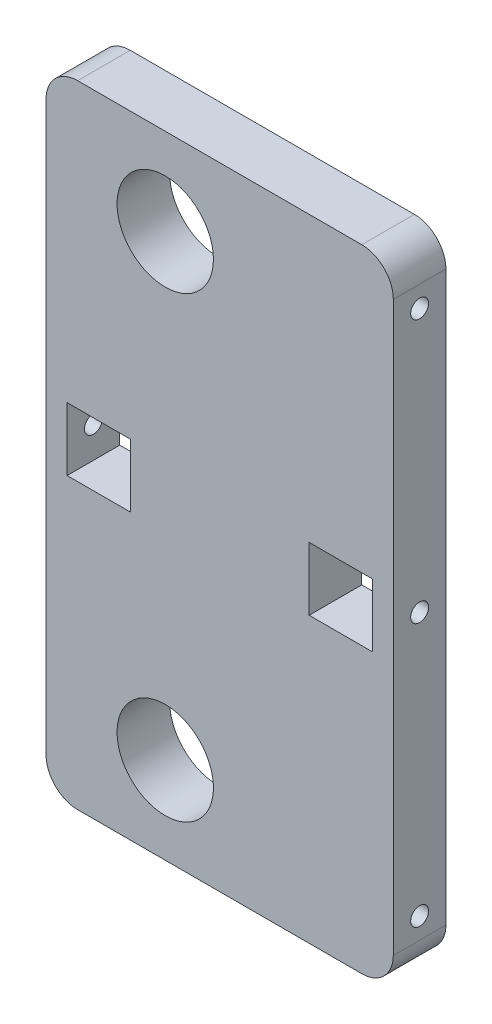
ISO-10303-21;
HEADER;
FILE_DESCRIPTION(('STEP AP214'),'2;1');
FILE_NAME('part.step','',(''),(''),'','','');
FILE_SCHEMA(('AUTOMOTIVE_DESIGN { 1 0 10303 214 1 1 1 1 }'));
ENDSEC;
DATA;
#1=APPLICATION_CONTEXT('core data for automotive mechanical design processes');
#2=APPLICATION_PROTOCOL_DEFINITION('international standard','automotive_design',2000,#1);
#3=PRODUCT_CONTEXT('',#1,'mechanical');
#4=PRODUCT('Part','Part','',(#3));
#5=PRODUCT_RELATED_PRODUCT_CATEGORY('part','',(#4));
#6=PRODUCT_DEFINITION_FORMATION('','',#4);
#7=PRODUCT_DEFINITION_CONTEXT('part definition',#1,'design');
#8=PRODUCT_DEFINITION('design','',#6,#7);
#9=PRODUCT_DEFINITION_SHAPE('','',#8);
#10=(LENGTH_UNIT() NAMED_UNIT(*) SI_UNIT(.MILLI.,.METRE.));
#11=(NAMED_UNIT(*) PLANE_ANGLE_UNIT() SI_UNIT($,.RADIAN.));
#12=(NAMED_UNIT(*) SI_UNIT($,.STERADIAN.) SOLID_ANGLE_UNIT());
#13=UNCERTAINTY_MEASURE_WITH_UNIT(LENGTH_MEASURE(1.E-05),#10,'distance_accuracy_value','');
#14=(GEOMETRIC_REPRESENTATION_CONTEXT(3) GLOBAL_UNCERTAINTY_ASSIGNED_CONTEXT((#13)) GLOBAL_UNIT_ASSIGNED_CONTEXT((#10,
#11,#12)) REPRESENTATION_CONTEXT('',''));
#15=CARTESIAN_POINT('',(0.,0.,0.));
#16=DIRECTION('',(0.,0.,1.));
#17=DIRECTION('',(1.,0.,0.));
#18=AXIS2_PLACEMENT_3D('',#15,#16,#17);
#19=CARTESIAN_POINT('',(0.,0.,5.));
#20=DIRECTION('',(0.,0.,-1.));
#21=DIRECTION('',(-1.,0.,0.));
#22=AXIS2_PLACEMENT_3D('',#19,#20,#21);
#23=PLANE('',#22);
#24=DIRECTION('',(0.,1.,0.));
#25=VECTOR('',#24,1.);
#26=CARTESIAN_POINT('',(-8.5,-3.,5.));
#27=LINE('',#26,#25);
#28=CARTESIAN_POINT('',(-8.5,-3.,5.));
#29=VERTEX_POINT('',#28);
#30=CARTESIAN_POINT('',(-8.5,3.,5.));
#31=VERTEX_POINT('',#30);
#32=EDGE_CURVE('E212',#29,#31,#27,.T.);
#33=ORIENTED_EDGE('',*,*,#32,.F.);
#34=DIRECTION('',(1.,0.,0.));
#35=VECTOR('',#34,1.);
#36=CARTESIAN_POINT('',(-14.5,-3.,5.));
#37=LINE('',#36,#35);
#38=CARTESIAN_POINT('',(-14.5,-3.,5.));
#39=VERTEX_POINT('',#38);
#40=EDGE_CURVE('E223',#39,#29,#37,.T.);
#41=ORIENTED_EDGE('',*,*,#40,.F.);
#42=DIRECTION('',(0.,-1.,0.));
#43=VECTOR('',#42,1.);
#44=CARTESIAN_POINT('',(-14.5,-3.,5.));
#45=LINE('',#44,#43);
#46=CARTESIAN_POINT('',(-14.5,3.,5.));
#47=VERTEX_POINT('',#46);
#48=EDGE_CURVE('E219',#47,#39,#45,.T.);
#49=ORIENTED_EDGE('',*,*,#48,.F.);
#50=DIRECTION('',(-1.,0.,0.));
#51=VECTOR('',#50,1.);
#52=CARTESIAN_POINT('',(-14.5,3.,5.));
#53=LINE('',#52,#51);
#54=EDGE_CURVE('E215',#31,#47,#53,.T.);
#55=ORIENTED_EDGE('',*,*,#54,.F.);
#56=EDGE_LOOP('',(#33,#41,#49,#55));
#57=FACE_BOUND('',#56,.T.);
#58=DIRECTION('',(1.,0.,0.));
#59=VECTOR('',#58,1.);
#60=CARTESIAN_POINT('',(-16.5,-30.,5.));
#61=LINE('',#60,#59);
#62=CARTESIAN_POINT('',(-13.5,-30.,5.));
#63=VERTEX_POINT('',#62);
#64=CARTESIAN_POINT('',(13.5,-30.,5.));
#65=VERTEX_POINT('',#64);
#66=EDGE_CURVE('E282',#63,#65,#61,.T.);
#67=ORIENTED_EDGE('',*,*,#66,.T.);
#68=CARTESIAN_POINT('',(13.5,-27.,5.));
#69=DIRECTION('',(0.,0.,-1.));
#70=DIRECTION('',(-1.,0.,0.));
#71=AXIS2_PLACEMENT_3D('',#68,#69,#70);
#72=CIRCLE('',#71,3.);
#73=CARTESIAN_POINT('',(16.5,-27.,5.));
#74=VERTEX_POINT('',#73);
#75=EDGE_CURVE('E343',#65,#74,#72,.F.);
#76=ORIENTED_EDGE('',*,*,#75,.T.);
#77=DIRECTION('',(0.,1.,0.));
#78=VECTOR('',#77,1.);
#79=CARTESIAN_POINT('',(16.5,-30.,5.));
#80=LINE('',#79,#78);
#81=CARTESIAN_POINT('',(16.5,27.,5.));
#82=VERTEX_POINT('',#81);
#83=EDGE_CURVE('E271',#74,#82,#80,.T.);
#84=ORIENTED_EDGE('',*,*,#83,.T.);
#85=CARTESIAN_POINT('',(13.5,27.,5.));
#86=DIRECTION('',(0.,0.,-1.));
#87=DIRECTION('',(-1.,0.,0.));
#88=AXIS2_PLACEMENT_3D('',#85,#86,#87);
#89=CIRCLE('',#88,3.);
#90=CARTESIAN_POINT('',(13.5,30.,5.));
#91=VERTEX_POINT('',#90);
#92=EDGE_CURVE('E335',#82,#91,#89,.F.);
#93=ORIENTED_EDGE('',*,*,#92,.T.);
#94=DIRECTION('',(-1.,0.,0.));
#95=VECTOR('',#94,1.);
#96=CARTESIAN_POINT('',(-16.5,30.,5.));
#97=LINE('',#96,#95);
#98=CARTESIAN_POINT('',(-13.5,30.,5.));
#99=VERTEX_POINT('',#98);
#100=EDGE_CURVE('E275',#91,#99,#97,.T.);
#101=ORIENTED_EDGE('',*,*,#100,.T.);
#102=CARTESIAN_POINT('',(-13.5,27.,5.));
#103=DIRECTION('',(0.,0.,-1.));
#104=DIRECTION('',(-1.,0.,0.));
#105=AXIS2_PLACEMENT_3D('',#102,#103,#104);
#106=CIRCLE('',#105,3.);
#107=CARTESIAN_POINT('',(-16.5,27.,5.));
#108=VERTEX_POINT('',#107);
#109=EDGE_CURVE('E64',#99,#108,#106,.F.);
#110=ORIENTED_EDGE('',*,*,#109,.T.);
#111=DIRECTION('',(0.,-1.,0.));
#112=VECTOR('',#111,1.);
#113=CARTESIAN_POINT('',(-16.5,-30.,5.));
#114=LINE('',#113,#112);
#115=CARTESIAN_POINT('',(-16.5,-27.,5.));
#116=VERTEX_POINT('',#115);
#117=EDGE_CURVE('E279',#108,#116,#114,.T.);
#118=ORIENTED_EDGE('',*,*,#117,.T.);
#119=CARTESIAN_POINT('',(-13.5,-27.,5.));
#120=DIRECTION('',(0.,0.,-1.));
#121=DIRECTION('',(-1.,0.,0.));
#122=AXIS2_PLACEMENT_3D('',#119,#120,#121);
#123=CIRCLE('',#122,3.);
#124=EDGE_CURVE('E340',#116,#63,#123,.F.);
#125=ORIENTED_EDGE('',*,*,#124,.T.);
#126=EDGE_LOOP('',(#67,#76,#84,#93,#101,#110,#118,#125));
#127=FACE_BOUND('',#126,.T.);
#128=CARTESIAN_POINT('',(-5.175,21.75,5.));
#129=DIRECTION('',(0.,0.,1.));
#130=DIRECTION('',(1.,0.,0.));
#131=AXIS2_PLACEMENT_3D('',#128,#129,#130);
#132=CIRCLE('',#131,4.58);
#133=CARTESIAN_POINT('',(-0.595000000000001,21.75,5.));
#134=VERTEX_POINT('',#133);
#135=EDGE_CURVE('E263',#134,#134,#132,.T.);
#136=ORIENTED_EDGE('',*,*,#135,.F.);
#137=EDGE_LOOP('',(#136));
#138=FACE_BOUND('',#137,.T.);
#139=CARTESIAN_POINT('',(-5.17499999999999,-21.75,5.));
#140=DIRECTION('',(0.,0.,1.));
#141=DIRECTION('',(-1.,0.,0.));
#142=AXIS2_PLACEMENT_3D('',#139,#140,#141);
#143=CIRCLE('',#142,4.58);
#144=CARTESIAN_POINT('',(-9.75499999999999,-21.75,5.));
#145=VERTEX_POINT('',#144);
#146=EDGE_CURVE('E255',#145,#145,#143,.T.);
#147=ORIENTED_EDGE('',*,*,#146,.F.);
#148=EDGE_LOOP('',(#147));
#149=FACE_BOUND('',#148,.T.);
#150=DIRECTION('',(0.,1.,0.));
#151=VECTOR('',#150,1.);
#152=CARTESIAN_POINT('',(14.5,-3.,5.));
#153=LINE('',#152,#151);
#154=CARTESIAN_POINT('',(14.5,-3.,5.));
#155=VERTEX_POINT('',#154);
#156=CARTESIAN_POINT('',(14.5,3.,5.));
#157=VERTEX_POINT('',#156);
#158=EDGE_CURVE('E157',#155,#157,#153,.T.);
#159=ORIENTED_EDGE('',*,*,#158,.F.);
#160=DIRECTION('',(1.,0.,0.));
#161=VECTOR('',#160,1.);
#162=CARTESIAN_POINT('',(14.5,-3.,5.));
#163=LINE('',#162,#161);
#164=CARTESIAN_POINT('',(8.50000000000001,-3.,5.));
#165=VERTEX_POINT('',#164);
#166=EDGE_CURVE('E186',#165,#155,#163,.T.);
#167=ORIENTED_EDGE('',*,*,#166,.F.);
#168=DIRECTION('',(0.,-1.,0.));
#169=VECTOR('',#168,1.);
#170=CARTESIAN_POINT('',(8.50000000000001,-3.,5.));
#171=LINE('',#170,#169);
#172=CARTESIAN_POINT('',(8.50000000000001,3.,5.));
#173=VERTEX_POINT('',#172);
#174=EDGE_CURVE('E182',#173,#165,#171,.T.);
#175=ORIENTED_EDGE('',*,*,#174,.F.);
#176=DIRECTION('',(-1.,0.,0.));
#177=VECTOR('',#176,1.);
#178=CARTESIAN_POINT('',(14.5,3.,5.));
#179=LINE('',#178,#177);
#180=EDGE_CURVE('E168',#157,#173,#179,.T.);
#181=ORIENTED_EDGE('',*,*,#180,.F.);
#182=EDGE_LOOP('',(#159,#167,#175,#181));
#183=FACE_BOUND('',#182,.T.);
#184=ADVANCED_FACE('F41',(#57,#127,#138,#149,#183),#23,.F.);
#185=CARTESIAN_POINT('',(0.,0.,0.));
#186=DIRECTION('',(0.,0.,-1.));
#187=DIRECTION('',(-1.,0.,0.));
#188=AXIS2_PLACEMENT_3D('',#185,#186,#187);
#189=PLANE('',#188);
#190=CARTESIAN_POINT('',(-5.175,21.75,0.));
#191=DIRECTION('',(0.,0.,1.));
#192=DIRECTION('',(1.,0.,0.));
#193=AXIS2_PLACEMENT_3D('',#190,#191,#192);
#194=CIRCLE('',#193,4.58);
#195=CARTESIAN_POINT('',(-0.595000000000001,21.75,0.));
#196=VERTEX_POINT('',#195);
#197=EDGE_CURVE('E259',#196,#196,#194,.T.);
#198=ORIENTED_EDGE('',*,*,#197,.T.);
#199=EDGE_LOOP('',(#198));
#200=FACE_BOUND('',#199,.T.);
#201=DIRECTION('',(0.,1.,0.));
#202=VECTOR('',#201,1.);
#203=CARTESIAN_POINT('',(16.5,-30.,0.));
#204=LINE('',#203,#202);
#205=CARTESIAN_POINT('',(16.5,-27.,0.));
#206=VERTEX_POINT('',#205);
#207=CARTESIAN_POINT('',(16.5,27.,0.));
#208=VERTEX_POINT('',#207);
#209=EDGE_CURVE('E267',#206,#208,#204,.T.);
#210=ORIENTED_EDGE('',*,*,#209,.F.);
#211=CARTESIAN_POINT('',(13.5,-27.,0.));
#212=DIRECTION('',(0.,0.,-1.));
#213=DIRECTION('',(-1.,0.,0.));
#214=AXIS2_PLACEMENT_3D('',#211,#212,#213);
#215=CIRCLE('',#214,3.);
#216=CARTESIAN_POINT('',(13.5,-30.,0.));
#217=VERTEX_POINT('',#216);
#218=EDGE_CURVE('E325',#206,#217,#215,.T.);
#219=ORIENTED_EDGE('',*,*,#218,.T.);
#220=DIRECTION('',(1.,0.,0.));
#221=VECTOR('',#220,1.);
#222=CARTESIAN_POINT('',(-16.5,-30.,0.));
#223=LINE('',#222,#221);
#224=CARTESIAN_POINT('',(-13.5,-30.,0.));
#225=VERTEX_POINT('',#224);
#226=EDGE_CURVE('E276',#225,#217,#223,.T.);
#227=ORIENTED_EDGE('',*,*,#226,.F.);
#228=CARTESIAN_POINT('',(-13.5,-27.,0.));
#229=DIRECTION('',(0.,0.,-1.));
#230=DIRECTION('',(-1.,0.,0.));
#231=AXIS2_PLACEMENT_3D('',#228,#229,#230);
#232=CIRCLE('',#231,3.);
#233=CARTESIAN_POINT('',(-16.5,-27.,0.));
#234=VERTEX_POINT('',#233);
#235=EDGE_CURVE('E322',#225,#234,#232,.T.);
#236=ORIENTED_EDGE('',*,*,#235,.T.);
#237=DIRECTION('',(0.,-1.,0.));
#238=VECTOR('',#237,1.);
#239=CARTESIAN_POINT('',(-16.5,-30.,0.));
#240=LINE('',#239,#238);
#241=CARTESIAN_POINT('',(-16.5,27.,0.));
#242=VERTEX_POINT('',#241);
#243=EDGE_CURVE('E294',#242,#234,#240,.T.);
#244=ORIENTED_EDGE('',*,*,#243,.F.);
#245=CARTESIAN_POINT('',(-13.5,27.,0.));
#246=DIRECTION('',(0.,0.,-1.));
#247=DIRECTION('',(-1.,0.,0.));
#248=AXIS2_PLACEMENT_3D('',#245,#246,#247);
#249=CIRCLE('',#248,3.);
#250=CARTESIAN_POINT('',(-13.5,30.,0.));
#251=VERTEX_POINT('',#250);
#252=EDGE_CURVE('E319',#242,#251,#249,.T.);
#253=ORIENTED_EDGE('',*,*,#252,.T.);
#254=DIRECTION('',(-1.,0.,0.));
#255=VECTOR('',#254,1.);
#256=CARTESIAN_POINT('',(-16.5,30.,0.));
#257=LINE('',#256,#255);
#258=CARTESIAN_POINT('',(13.5,30.,0.));
#259=VERTEX_POINT('',#258);
#260=EDGE_CURVE('E290',#259,#251,#257,.T.);
#261=ORIENTED_EDGE('',*,*,#260,.F.);
#262=CARTESIAN_POINT('',(13.5,27.,0.));
#263=DIRECTION('',(0.,0.,-1.));
#264=DIRECTION('',(-1.,0.,0.));
#265=AXIS2_PLACEMENT_3D('',#262,#263,#264);
#266=CIRCLE('',#265,3.);
#267=EDGE_CURVE('E316',#259,#208,#266,.T.);
#268=ORIENTED_EDGE('',*,*,#267,.T.);
#269=EDGE_LOOP('',(#210,#219,#227,#236,#244,#253,#261,#268));
#270=FACE_BOUND('',#269,.T.);
#271=CARTESIAN_POINT('',(-5.17499999999999,-21.75,0.));
#272=DIRECTION('',(0.,0.,1.));
#273=DIRECTION('',(-1.,0.,0.));
#274=AXIS2_PLACEMENT_3D('',#271,#272,#273);
#275=CIRCLE('',#274,4.58);
#276=CARTESIAN_POINT('',(-9.75499999999999,-21.75,0.));
#277=VERTEX_POINT('',#276);
#278=EDGE_CURVE('E254',#277,#277,#275,.T.);
#279=ORIENTED_EDGE('',*,*,#278,.T.);
#280=EDGE_LOOP('',(#279));
#281=FACE_BOUND('',#280,.T.);
#282=DIRECTION('',(1.,0.,0.));
#283=VECTOR('',#282,1.);
#284=CARTESIAN_POINT('',(-14.5,-3.,0.));
#285=LINE('',#284,#283);
#286=CARTESIAN_POINT('',(-14.5,-3.,0.));
#287=VERTEX_POINT('',#286);
#288=CARTESIAN_POINT('',(-8.5,-3.,0.));
#289=VERTEX_POINT('',#288);
#290=EDGE_CURVE('E216',#287,#289,#285,.T.);
#291=ORIENTED_EDGE('',*,*,#290,.T.);
#292=DIRECTION('',(0.,1.,0.));
#293=VECTOR('',#292,1.);
#294=CARTESIAN_POINT('',(-8.5,-3.,0.));
#295=LINE('',#294,#293);
#296=CARTESIAN_POINT('',(-8.5,3.,0.));
#297=VERTEX_POINT('',#296);
#298=EDGE_CURVE('E177',#289,#297,#295,.T.);
#299=ORIENTED_EDGE('',*,*,#298,.T.);
#300=DIRECTION('',(-1.,0.,0.));
#301=VECTOR('',#300,1.);
#302=CARTESIAN_POINT('',(-14.5,3.,0.));
#303=LINE('',#302,#301);
#304=CARTESIAN_POINT('',(-14.5,3.,0.));
#305=VERTEX_POINT('',#304);
#306=EDGE_CURVE('E230',#297,#305,#303,.T.);
#307=ORIENTED_EDGE('',*,*,#306,.T.);
#308=DIRECTION('',(0.,-1.,0.));
#309=VECTOR('',#308,1.);
#310=CARTESIAN_POINT('',(-14.5,-3.,0.));
#311=LINE('',#310,#309);
#312=EDGE_CURVE('E234',#305,#287,#311,.T.);
#313=ORIENTED_EDGE('',*,*,#312,.T.);
#314=EDGE_LOOP('',(#291,#299,#307,#313));
#315=FACE_BOUND('',#314,.T.);
#316=DIRECTION('',(1.,0.,0.));
#317=VECTOR('',#316,1.);
#318=CARTESIAN_POINT('',(14.5,-3.,0.));
#319=LINE('',#318,#317);
#320=CARTESIAN_POINT('',(8.50000000000001,-3.,0.));
#321=VERTEX_POINT('',#320);
#322=CARTESIAN_POINT('',(14.5,-3.,0.));
#323=VERTEX_POINT('',#322);
#324=EDGE_CURVE('E169',#321,#323,#319,.T.);
#325=ORIENTED_EDGE('',*,*,#324,.T.);
#326=DIRECTION('',(0.,1.,0.));
#327=VECTOR('',#326,1.);
#328=CARTESIAN_POINT('',(14.5,-3.,0.));
#329=LINE('',#328,#327);
#330=CARTESIAN_POINT('',(14.5,3.,0.));
#331=VERTEX_POINT('',#330);
#332=EDGE_CURVE('E192',#323,#331,#329,.T.);
#333=ORIENTED_EDGE('',*,*,#332,.T.);
#334=DIRECTION('',(-1.,0.,0.));
#335=VECTOR('',#334,1.);
#336=CARTESIAN_POINT('',(14.5,3.,0.));
#337=LINE('',#336,#335);
#338=CARTESIAN_POINT('',(8.50000000000001,3.,0.));
#339=VERTEX_POINT('',#338);
#340=EDGE_CURVE('E175',#331,#339,#337,.T.);
#341=ORIENTED_EDGE('',*,*,#340,.T.);
#342=DIRECTION('',(0.,-1.,0.));
#343=VECTOR('',#342,1.);
#344=CARTESIAN_POINT('',(8.50000000000001,-3.,0.));
#345=LINE('',#344,#343);
#346=EDGE_CURVE('E198',#339,#321,#345,.T.);
#347=ORIENTED_EDGE('',*,*,#346,.T.);
#348=EDGE_LOOP('',(#325,#333,#341,#347));
#349=FACE_BOUND('',#348,.T.);
#350=ADVANCED_FACE('F363',(#200,#270,#281,#315,#349),#189,.T.);
#351=CARTESIAN_POINT('',(16.5,-30.,5.));
#352=DIRECTION('',(-1.,0.,0.));
#353=DIRECTION('',(0.,0.,1.));
#354=AXIS2_PLACEMENT_3D('',#351,#352,#353);
#355=PLANE('',#354);
#356=CARTESIAN_POINT('',(16.5,25.,2.49999999999999));
#357=DIRECTION('',(1.,0.,0.));
#358=DIRECTION('',(0.,0.,1.));
#359=AXIS2_PLACEMENT_3D('',#356,#357,#358);
#360=CIRCLE('',#359,0.85);
#361=CARTESIAN_POINT('',(16.5,25.,3.34999999999999));
#362=VERTEX_POINT('',#361);
#363=EDGE_CURVE('E308',#362,#362,#360,.T.);
#364=ORIENTED_EDGE('',*,*,#363,.F.);
#365=EDGE_LOOP('',(#364));
#366=FACE_BOUND('',#365,.T.);
#367=CARTESIAN_POINT('',(16.5,-25.,2.49999999999999));
#368=DIRECTION('',(1.,0.,0.));
#369=DIRECTION('',(0.,0.,-1.));
#370=AXIS2_PLACEMENT_3D('',#367,#368,#369);
#371=CIRCLE('',#370,0.85);
#372=CARTESIAN_POINT('',(16.5,-25.,1.64999999999999));
#373=VERTEX_POINT('',#372);
#374=EDGE_CURVE('E659',#373,#373,#371,.T.);
#375=ORIENTED_EDGE('',*,*,#374,.F.);
#376=EDGE_LOOP('',(#375));
#377=FACE_BOUND('',#376,.T.);
#378=CARTESIAN_POINT('',(16.5,0.,2.5));
#379=DIRECTION('',(1.,0.,0.));
#380=DIRECTION('',(0.,0.,-1.));
#381=AXIS2_PLACEMENT_3D('',#378,#379,#380);
#382=CIRCLE('',#381,0.85);
#383=CARTESIAN_POINT('',(16.5,0.,1.65));
#384=VERTEX_POINT('',#383);
#385=EDGE_CURVE('E303',#384,#384,#382,.T.);
#386=ORIENTED_EDGE('',*,*,#385,.F.);
#387=EDGE_LOOP('',(#386));
#388=FACE_BOUND('',#387,.T.);
#389=ORIENTED_EDGE('',*,*,#83,.F.);
#390=DIRECTION('',(0.,0.,-1.));
#391=VECTOR('',#390,1.);
#392=CARTESIAN_POINT('',(16.5,-27.,5.));
#393=LINE('',#392,#391);
#394=EDGE_CURVE('E312',#74,#206,#393,.T.);
#395=ORIENTED_EDGE('',*,*,#394,.T.);
#396=ORIENTED_EDGE('',*,*,#209,.T.);
#397=DIRECTION('',(0.,0.,-1.));
#398=VECTOR('',#397,1.);
#399=CARTESIAN_POINT('',(16.5,27.,5.));
#400=LINE('',#399,#398);
#401=EDGE_CURVE('E286',#208,#82,#400,.F.);
#402=ORIENTED_EDGE('',*,*,#401,.T.);
#403=EDGE_LOOP('',(#389,#395,#396,#402));
#404=FACE_BOUND('',#403,.T.);
#405=ADVANCED_FACE('F386',(#366,#377,#388,#404),#355,.F.);
#406=CARTESIAN_POINT('',(-16.5,30.,5.));
#407=DIRECTION('',(0.,-1.,0.));
#408=DIRECTION('',(1.,0.,0.));
#409=AXIS2_PLACEMENT_3D('',#406,#407,#408);
#410=PLANE('',#409);
#411=ORIENTED_EDGE('',*,*,#260,.T.);
#412=DIRECTION('',(0.,0.,-1.));
#413=VECTOR('',#412,1.);
#414=CARTESIAN_POINT('',(-13.5,30.,5.));
#415=LINE('',#414,#413);
#416=EDGE_CURVE('E11',#251,#99,#415,.F.);
#417=ORIENTED_EDGE('',*,*,#416,.T.);
#418=ORIENTED_EDGE('',*,*,#100,.F.);
#419=DIRECTION('',(0.,0.,-1.));
#420=VECTOR('',#419,1.);
#421=CARTESIAN_POINT('',(13.5,30.,5.));
#422=LINE('',#421,#420);
#423=EDGE_CURVE('E50',#91,#259,#422,.T.);
#424=ORIENTED_EDGE('',*,*,#423,.T.);
#425=EDGE_LOOP('',(#411,#417,#418,#424));
#426=FACE_BOUND('',#425,.T.);
#427=ADVANCED_FACE('F357',(#426),#410,.F.);
#428=CARTESIAN_POINT('',(-16.5,-30.,5.));
#429=DIRECTION('',(1.,0.,0.));
#430=DIRECTION('',(0.,0.,-1.));
#431=AXIS2_PLACEMENT_3D('',#428,#429,#430);
#432=PLANE('',#431);
#433=CARTESIAN_POINT('',(-16.5,0.,2.5));
#434=DIRECTION('',(-1.,0.,0.));
#435=DIRECTION('',(0.,0.,1.));
#436=AXIS2_PLACEMENT_3D('',#433,#434,#435);
#437=CIRCLE('',#436,0.85);
#438=CARTESIAN_POINT('',(-16.5,0.,3.35));
#439=VERTEX_POINT('',#438);
#440=EDGE_CURVE('E309',#439,#439,#437,.T.);
#441=ORIENTED_EDGE('',*,*,#440,.F.);
#442=EDGE_LOOP('',(#441));
#443=FACE_BOUND('',#442,.T.);
#444=ORIENTED_EDGE('',*,*,#243,.T.);
#445=DIRECTION('',(0.,0.,-1.));
#446=VECTOR('',#445,1.);
#447=CARTESIAN_POINT('',(-16.5,-27.,5.));
#448=LINE('',#447,#446);
#449=EDGE_CURVE('E57',#234,#116,#448,.F.);
#450=ORIENTED_EDGE('',*,*,#449,.T.);
#451=ORIENTED_EDGE('',*,*,#117,.F.);
#452=DIRECTION('',(0.,0.,-1.));
#453=VECTOR('',#452,1.);
#454=CARTESIAN_POINT('',(-16.5,27.,5.));
#455=LINE('',#454,#453);
#456=EDGE_CURVE('E346',#108,#242,#455,.T.);
#457=ORIENTED_EDGE('',*,*,#456,.T.);
#458=EDGE_LOOP('',(#444,#450,#451,#457));
#459=FACE_BOUND('',#458,.T.);
#460=ADVANCED_FACE('F369',(#443,#459),#432,.F.);
#461=CARTESIAN_POINT('',(-16.5,-30.,5.));
#462=DIRECTION('',(0.,1.,0.));
#463=DIRECTION('',(-1.,0.,0.));
#464=AXIS2_PLACEMENT_3D('',#461,#462,#463);
#465=PLANE('',#464);
#466=ORIENTED_EDGE('',*,*,#226,.T.);
#467=DIRECTION('',(0.,0.,-1.));
#468=VECTOR('',#467,1.);
#469=CARTESIAN_POINT('',(13.5,-30.,5.));
#470=LINE('',#469,#468);
#471=EDGE_CURVE('E332',#217,#65,#470,.F.);
#472=ORIENTED_EDGE('',*,*,#471,.T.);
#473=ORIENTED_EDGE('',*,*,#66,.F.);
#474=DIRECTION('',(0.,0.,-1.));
#475=VECTOR('',#474,1.);
#476=CARTESIAN_POINT('',(-13.5,-30.,5.));
#477=LINE('',#476,#475);
#478=EDGE_CURVE('E328',#63,#225,#477,.T.);
#479=ORIENTED_EDGE('',*,*,#478,.T.);
#480=EDGE_LOOP('',(#466,#472,#473,#479));
#481=FACE_BOUND('',#480,.T.);
#482=ADVANCED_FACE('F378',(#481),#465,.F.);
#483=CARTESIAN_POINT('',(-5.175,21.75,5.));
#484=DIRECTION('',(0.,0.,-1.));
#485=DIRECTION('',(-1.,0.,0.));
#486=AXIS2_PLACEMENT_3D('',#483,#484,#485);
#487=CYLINDRICAL_SURFACE('',#486,4.58);
#488=ORIENTED_EDGE('',*,*,#135,.T.);
#489=EDGE_LOOP('',(#488));
#490=FACE_BOUND('',#489,.T.);
#491=ORIENTED_EDGE('',*,*,#197,.F.);
#492=EDGE_LOOP('',(#491));
#493=FACE_BOUND('',#492,.T.);
#494=ADVANCED_FACE('F402',(#490,#493),#487,.F.);
#495=CARTESIAN_POINT('',(-5.17499999999999,-21.75,5.));
#496=DIRECTION('',(0.,0.,-1.));
#497=DIRECTION('',(-1.,0.,0.));
#498=AXIS2_PLACEMENT_3D('',#495,#496,#497);
#499=CYLINDRICAL_SURFACE('',#498,4.58);
#500=ORIENTED_EDGE('',*,*,#146,.T.);
#501=EDGE_LOOP('',(#500));
#502=FACE_BOUND('',#501,.T.);
#503=ORIENTED_EDGE('',*,*,#278,.F.);
#504=EDGE_LOOP('',(#503));
#505=FACE_BOUND('',#504,.T.);
#506=ADVANCED_FACE('F562',(#502,#505),#499,.F.);
#507=CARTESIAN_POINT('',(-8.5,-3.,5.));
#508=DIRECTION('',(-1.,0.,0.));
#509=DIRECTION('',(0.,0.,1.));
#510=AXIS2_PLACEMENT_3D('',#507,#508,#509);
#511=PLANE('',#510);
#512=ORIENTED_EDGE('',*,*,#298,.F.);
#513=DIRECTION('',(0.,0.,-1.));
#514=VECTOR('',#513,1.);
#515=CARTESIAN_POINT('',(-8.5,-3.,5.));
#516=LINE('',#515,#514);
#517=EDGE_CURVE('E226',#29,#289,#516,.T.);
#518=ORIENTED_EDGE('',*,*,#517,.F.);
#519=ORIENTED_EDGE('',*,*,#32,.T.);
#520=DIRECTION('',(0.,0.,-1.));
#521=VECTOR('',#520,1.);
#522=CARTESIAN_POINT('',(-8.5,3.,5.));
#523=LINE('',#522,#521);
#524=EDGE_CURVE('E250',#31,#297,#523,.T.);
#525=ORIENTED_EDGE('',*,*,#524,.T.);
#526=EDGE_LOOP('',(#512,#518,#519,#525));
#527=FACE_BOUND('',#526,.T.);
#528=ADVANCED_FACE('F553',(#527),#511,.T.);
#529=CARTESIAN_POINT('',(-14.5,3.,5.));
#530=DIRECTION('',(0.,-1.,0.));
#531=DIRECTION('',(0.,0.,-1.));
#532=AXIS2_PLACEMENT_3D('',#529,#530,#531);
#533=PLANE('',#532);
#534=ORIENTED_EDGE('',*,*,#306,.F.);
#535=ORIENTED_EDGE('',*,*,#524,.F.);
#536=ORIENTED_EDGE('',*,*,#54,.T.);
#537=DIRECTION('',(0.,0.,-1.));
#538=VECTOR('',#537,1.);
#539=CARTESIAN_POINT('',(-14.5,3.,5.));
#540=LINE('',#539,#538);
#541=EDGE_CURVE('E247',#47,#305,#540,.T.);
#542=ORIENTED_EDGE('',*,*,#541,.T.);
#543=EDGE_LOOP('',(#534,#535,#536,#542));
#544=FACE_BOUND('',#543,.T.);
#545=ADVANCED_FACE('F545',(#544),#533,.T.);
#546=CARTESIAN_POINT('',(-14.5,-3.,5.));
#547=DIRECTION('',(1.,0.,0.));
#548=DIRECTION('',(0.,0.,-1.));
#549=AXIS2_PLACEMENT_3D('',#546,#547,#548);
#550=PLANE('',#549);
#551=CARTESIAN_POINT('',(-14.5,0.,2.5));
#552=DIRECTION('',(1.,0.,0.));
#553=DIRECTION('',(0.,0.,-1.));
#554=AXIS2_PLACEMENT_3D('',#551,#552,#553);
#555=CIRCLE('',#554,0.85);
#556=CARTESIAN_POINT('',(-14.5,0.,1.65));
#557=VERTEX_POINT('',#556);
#558=EDGE_CURVE('E304',#557,#557,#555,.T.);
#559=ORIENTED_EDGE('',*,*,#558,.F.);
#560=EDGE_LOOP('',(#559));
#561=FACE_BOUND('',#560,.T.);
#562=ORIENTED_EDGE('',*,*,#312,.F.);
#563=ORIENTED_EDGE('',*,*,#541,.F.);
#564=ORIENTED_EDGE('',*,*,#48,.T.);
#565=DIRECTION('',(0.,0.,-1.));
#566=VECTOR('',#565,1.);
#567=CARTESIAN_POINT('',(-14.5,-3.,5.));
#568=LINE('',#567,#566);
#569=EDGE_CURVE('E244',#39,#287,#568,.T.);
#570=ORIENTED_EDGE('',*,*,#569,.T.);
#571=EDGE_LOOP('',(#562,#563,#564,#570));
#572=FACE_BOUND('',#571,.T.);
#573=ADVANCED_FACE('F536',(#561,#572),#550,.T.);
#574=CARTESIAN_POINT('',(-14.5,-3.,5.));
#575=DIRECTION('',(0.,1.,0.));
#576=DIRECTION('',(0.,0.,1.));
#577=AXIS2_PLACEMENT_3D('',#574,#575,#576);
#578=PLANE('',#577);
#579=ORIENTED_EDGE('',*,*,#290,.F.);
#580=ORIENTED_EDGE('',*,*,#569,.F.);
#581=ORIENTED_EDGE('',*,*,#40,.T.);
#582=ORIENTED_EDGE('',*,*,#517,.T.);
#583=EDGE_LOOP('',(#579,#580,#581,#582));
#584=FACE_BOUND('',#583,.T.);
#585=ADVANCED_FACE('F528',(#584),#578,.T.);
#586=CARTESIAN_POINT('',(14.5,-3.,5.));
#587=DIRECTION('',(-1.,0.,0.));
#588=DIRECTION('',(0.,0.,1.));
#589=AXIS2_PLACEMENT_3D('',#586,#587,#588);
#590=PLANE('',#589);
#591=CARTESIAN_POINT('',(14.5,0.,2.5));
#592=DIRECTION('',(-1.,0.,0.));
#593=DIRECTION('',(0.,0.,1.));
#594=AXIS2_PLACEMENT_3D('',#591,#592,#593);
#595=CIRCLE('',#594,0.85);
#596=CARTESIAN_POINT('',(14.5,0.,3.35));
#597=VERTEX_POINT('',#596);
#598=EDGE_CURVE('E195',#597,#597,#595,.T.);
#599=ORIENTED_EDGE('',*,*,#598,.F.);
#600=EDGE_LOOP('',(#599));
#601=FACE_BOUND('',#600,.T.);
#602=ORIENTED_EDGE('',*,*,#332,.F.);
#603=DIRECTION('',(0.,0.,-1.));
#604=VECTOR('',#603,1.);
#605=CARTESIAN_POINT('',(14.5,-3.,5.));
#606=LINE('',#605,#604);
#607=EDGE_CURVE('E163',#155,#323,#606,.T.);
#608=ORIENTED_EDGE('',*,*,#607,.F.);
#609=ORIENTED_EDGE('',*,*,#158,.T.);
#610=DIRECTION('',(0.,0.,-1.));
#611=VECTOR('',#610,1.);
#612=CARTESIAN_POINT('',(14.5,3.,5.));
#613=LINE('',#612,#611);
#614=EDGE_CURVE('E160',#157,#331,#613,.T.);
#615=ORIENTED_EDGE('',*,*,#614,.T.);
#616=EDGE_LOOP('',(#602,#608,#609,#615));
#617=FACE_BOUND('',#616,.T.);
#618=ADVANCED_FACE('F159',(#601,#617),#590,.T.);
#619=CARTESIAN_POINT('',(14.5,3.,5.));
#620=DIRECTION('',(0.,-1.,0.));
#621=DIRECTION('',(1.,0.,0.));
#622=AXIS2_PLACEMENT_3D('',#619,#620,#621);
#623=PLANE('',#622);
#624=ORIENTED_EDGE('',*,*,#340,.F.);
#625=ORIENTED_EDGE('',*,*,#614,.F.);
#626=ORIENTED_EDGE('',*,*,#180,.T.);
#627=DIRECTION('',(0.,0.,-1.));
#628=VECTOR('',#627,1.);
#629=CARTESIAN_POINT('',(8.50000000000001,3.,5.));
#630=LINE('',#629,#628);
#631=EDGE_CURVE('E178',#173,#339,#630,.T.);
#632=ORIENTED_EDGE('',*,*,#631,.T.);
#633=EDGE_LOOP('',(#624,#625,#626,#632));
#634=FACE_BOUND('',#633,.T.);
#635=ADVANCED_FACE('F172',(#634),#623,.T.);
#636=CARTESIAN_POINT('',(8.50000000000001,-3.,5.));
#637=DIRECTION('',(1.,0.,0.));
#638=DIRECTION('',(0.,0.,-1.));
#639=AXIS2_PLACEMENT_3D('',#636,#637,#638);
#640=PLANE('',#639);
#641=ORIENTED_EDGE('',*,*,#346,.F.);
#642=ORIENTED_EDGE('',*,*,#631,.F.);
#643=ORIENTED_EDGE('',*,*,#174,.T.);
#644=DIRECTION('',(0.,0.,-1.));
#645=VECTOR('',#644,1.);
#646=CARTESIAN_POINT('',(8.50000000000001,-3.,5.));
#647=LINE('',#646,#645);
#648=EDGE_CURVE('E207',#165,#321,#647,.T.);
#649=ORIENTED_EDGE('',*,*,#648,.T.);
#650=EDGE_LOOP('',(#641,#642,#643,#649));
#651=FACE_BOUND('',#650,.T.);
#652=ADVANCED_FACE('F504',(#651),#640,.T.);
#653=CARTESIAN_POINT('',(14.5,-3.,5.));
#654=DIRECTION('',(0.,1.,0.));
#655=DIRECTION('',(-1.,0.,0.));
#656=AXIS2_PLACEMENT_3D('',#653,#654,#655);
#657=PLANE('',#656);
#658=ORIENTED_EDGE('',*,*,#324,.F.);
#659=ORIENTED_EDGE('',*,*,#648,.F.);
#660=ORIENTED_EDGE('',*,*,#166,.T.);
#661=ORIENTED_EDGE('',*,*,#607,.T.);
#662=EDGE_LOOP('',(#658,#659,#660,#661));
#663=FACE_BOUND('',#662,.T.);
#664=ADVANCED_FACE('F494',(#663),#657,.T.);
#665=CARTESIAN_POINT('',(13.5,0.,2.5));
#666=DIRECTION('',(1.,0.,0.));
#667=DIRECTION('',(0.,0.,-1.));
#668=AXIS2_PLACEMENT_3D('',#665,#666,#667);
#669=CYLINDRICAL_SURFACE('',#668,0.85);
#670=ORIENTED_EDGE('',*,*,#598,.T.);
#671=EDGE_LOOP('',(#670));
#672=FACE_BOUND('',#671,.T.);
#673=ORIENTED_EDGE('',*,*,#385,.T.);
#674=EDGE_LOOP('',(#673));
#675=FACE_BOUND('',#674,.T.);
#676=ADVANCED_FACE('F485',(#672,#675),#669,.F.);
#677=CARTESIAN_POINT('',(13.5,-25.,2.49999999999999));
#678=DIRECTION('',(1.,0.,0.));
#679=DIRECTION('',(0.,0.,-1.));
#680=AXIS2_PLACEMENT_3D('',#677,#678,#679);
#681=CYLINDRICAL_SURFACE('',#680,0.85);
#682=CARTESIAN_POINT('',(13.5,-25.,2.49999999999999));
#683=DIRECTION('',(1.,0.,0.));
#684=DIRECTION('',(0.,0.,-1.));
#685=AXIS2_PLACEMENT_3D('',#682,#683,#684);
#686=CIRCLE('',#685,0.85);
#687=CARTESIAN_POINT('',(13.5,-25.,1.64999999999999));
#688=VERTEX_POINT('',#687);
#689=EDGE_CURVE('E655',#688,#688,#686,.T.);
#690=ORIENTED_EDGE('',*,*,#689,.F.);
#691=EDGE_LOOP('',(#690));
#692=FACE_BOUND('',#691,.T.);
#693=ORIENTED_EDGE('',*,*,#374,.T.);
#694=EDGE_LOOP('',(#693));
#695=FACE_BOUND('',#694,.T.);
#696=ADVANCED_FACE('F476',(#692,#695),#681,.F.);
#697=CARTESIAN_POINT('',(13.5,-25.,2.49999999999999));
#698=DIRECTION('',(1.,0.,0.));
#699=DIRECTION('',(0.,0.,-1.));
#700=AXIS2_PLACEMENT_3D('',#697,#698,#699);
#701=PLANE('',#700);
#702=ORIENTED_EDGE('',*,*,#689,.T.);
#703=EDGE_LOOP('',(#702));
#704=FACE_BOUND('',#703,.T.);
#705=ADVANCED_FACE('F467',(#704),#701,.T.);
#706=CARTESIAN_POINT('',(13.5,25.,2.49999999999999));
#707=DIRECTION('',(1.,0.,0.));
#708=DIRECTION('',(0.,0.,-1.));
#709=AXIS2_PLACEMENT_3D('',#706,#707,#708);
#710=CYLINDRICAL_SURFACE('',#709,0.85);
#711=CARTESIAN_POINT('',(13.5,25.,2.49999999999999));
#712=DIRECTION('',(1.,0.,0.));
#713=DIRECTION('',(0.,0.,1.));
#714=AXIS2_PLACEMENT_3D('',#711,#712,#713);
#715=CIRCLE('',#714,0.85);
#716=CARTESIAN_POINT('',(13.5,25.,3.34999999999999));
#717=VERTEX_POINT('',#716);
#718=EDGE_CURVE('E663',#717,#717,#715,.T.);
#719=ORIENTED_EDGE('',*,*,#718,.F.);
#720=EDGE_LOOP('',(#719));
#721=FACE_BOUND('',#720,.T.);
#722=ORIENTED_EDGE('',*,*,#363,.T.);
#723=EDGE_LOOP('',(#722));
#724=FACE_BOUND('',#723,.T.);
#725=ADVANCED_FACE('F458',(#721,#724),#710,.F.);
#726=CARTESIAN_POINT('',(13.5,25.,2.49999999999999));
#727=DIRECTION('',(-1.,0.,0.));
#728=DIRECTION('',(0.,0.,1.));
#729=AXIS2_PLACEMENT_3D('',#726,#727,#728);
#730=PLANE('',#729);
#731=ORIENTED_EDGE('',*,*,#718,.T.);
#732=EDGE_LOOP('',(#731));
#733=FACE_BOUND('',#732,.T.);
#734=ADVANCED_FACE('F448',(#733),#730,.F.);
#735=CARTESIAN_POINT('',(-13.5,0.,2.5));
#736=DIRECTION('',(-1.,0.,0.));
#737=DIRECTION('',(0.,0.,1.));
#738=AXIS2_PLACEMENT_3D('',#735,#736,#737);
#739=CYLINDRICAL_SURFACE('',#738,0.85);
#740=ORIENTED_EDGE('',*,*,#558,.T.);
#741=EDGE_LOOP('',(#740));
#742=FACE_BOUND('',#741,.T.);
#743=ORIENTED_EDGE('',*,*,#440,.T.);
#744=EDGE_LOOP('',(#743));
#745=FACE_BOUND('',#744,.T.);
#746=ADVANCED_FACE('F417',(#742,#745),#739,.F.);
#747=CARTESIAN_POINT('',(13.5,-27.,5.));
#748=DIRECTION('',(0.,0.,-1.));
#749=DIRECTION('',(-1.,0.,0.));
#750=AXIS2_PLACEMENT_3D('',#747,#748,#749);
#751=CYLINDRICAL_SURFACE('',#750,3.);
#752=ORIENTED_EDGE('',*,*,#75,.F.);
#753=ORIENTED_EDGE('',*,*,#471,.F.);
#754=ORIENTED_EDGE('',*,*,#218,.F.);
#755=ORIENTED_EDGE('',*,*,#394,.F.);
#756=EDGE_LOOP('',(#752,#753,#754,#755));
#757=FACE_BOUND('',#756,.T.);
#758=ADVANCED_FACE('F383',(#757),#751,.T.);
#759=CARTESIAN_POINT('',(-13.5,-27.,5.));
#760=DIRECTION('',(0.,0.,-1.));
#761=DIRECTION('',(-1.,0.,0.));
#762=AXIS2_PLACEMENT_3D('',#759,#760,#761);
#763=CYLINDRICAL_SURFACE('',#762,3.);
#764=ORIENTED_EDGE('',*,*,#124,.F.);
#765=ORIENTED_EDGE('',*,*,#449,.F.);
#766=ORIENTED_EDGE('',*,*,#235,.F.);
#767=ORIENTED_EDGE('',*,*,#478,.F.);
#768=EDGE_LOOP('',(#764,#765,#766,#767));
#769=FACE_BOUND('',#768,.T.);
#770=ADVANCED_FACE('F375',(#769),#763,.T.);
#771=CARTESIAN_POINT('',(-13.5,27.,5.));
#772=DIRECTION('',(0.,0.,-1.));
#773=DIRECTION('',(-1.,0.,0.));
#774=AXIS2_PLACEMENT_3D('',#771,#772,#773);
#775=CYLINDRICAL_SURFACE('',#774,3.);
#776=ORIENTED_EDGE('',*,*,#109,.F.);
#777=ORIENTED_EDGE('',*,*,#416,.F.);
#778=ORIENTED_EDGE('',*,*,#252,.F.);
#779=ORIENTED_EDGE('',*,*,#456,.F.);
#780=EDGE_LOOP('',(#776,#777,#778,#779));
#781=FACE_BOUND('',#780,.T.);
#782=ADVANCED_FACE('F368',(#781),#775,.T.);
#783=CARTESIAN_POINT('',(13.5,27.,5.));
#784=DIRECTION('',(0.,0.,-1.));
#785=DIRECTION('',(-1.,0.,0.));
#786=AXIS2_PLACEMENT_3D('',#783,#784,#785);
#787=CYLINDRICAL_SURFACE('',#786,3.);
#788=ORIENTED_EDGE('',*,*,#92,.F.);
#789=ORIENTED_EDGE('',*,*,#401,.F.);
#790=ORIENTED_EDGE('',*,*,#267,.F.);
#791=ORIENTED_EDGE('',*,*,#423,.F.);
#792=EDGE_LOOP('',(#788,#789,#790,#791));
#793=FACE_BOUND('',#792,.T.);
#794=ADVANCED_FACE('F43',(#793),#787,.T.);
#795=CLOSED_SHELL('',(#184,#350,#405,#427,#460,#482,#494,#506,#528,#545,#573,#585,#618,#635,
#652,#664,#676,#696,#705,#725,#734,#746,#758,#770,#782,#794));
#796=MANIFOLD_SOLID_BREP('B2',#795);
#797=ADVANCED_BREP_SHAPE_REPRESENTATION('',(#18,#796),#14);
#798=SHAPE_DEFINITION_REPRESENTATION(#9,#797);
ENDSEC;
END-ISO-10303-21;
